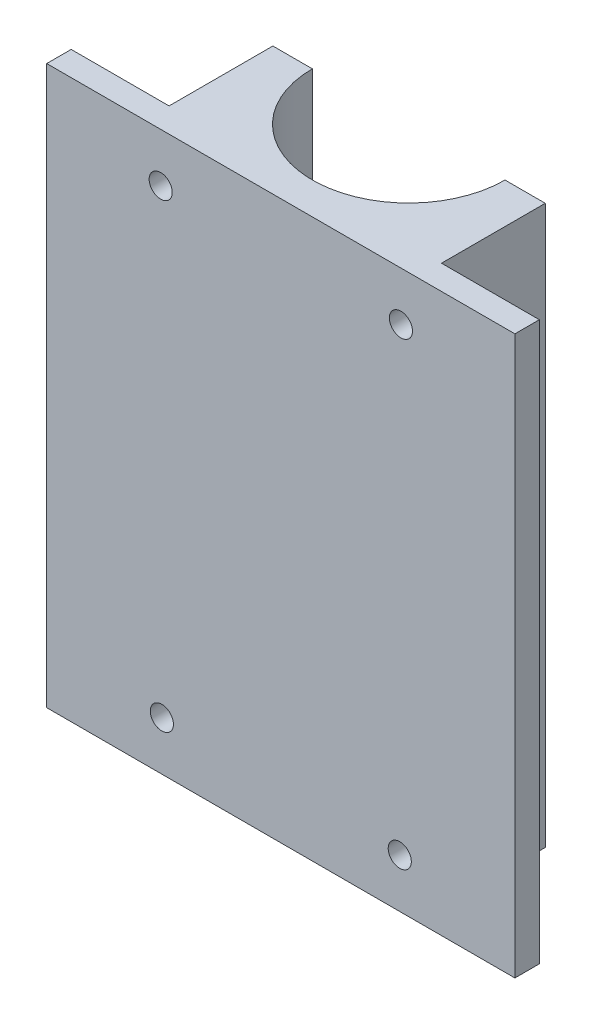
ISO-10303-21;
HEADER;
FILE_DESCRIPTION(('STEP AP214'),'2;1');
FILE_NAME('part.step','',(''),(''),'','','');
FILE_SCHEMA(('AUTOMOTIVE_DESIGN { 1 0 10303 214 1 1 1 1 }'));
ENDSEC;
DATA;
#1=APPLICATION_CONTEXT('core data for automotive mechanical design processes');
#2=APPLICATION_PROTOCOL_DEFINITION('international standard','automotive_design',2000,#1);
#3=PRODUCT_CONTEXT('',#1,'mechanical');
#4=PRODUCT('Part','Part','',(#3));
#5=PRODUCT_RELATED_PRODUCT_CATEGORY('part','',(#4));
#6=PRODUCT_DEFINITION_FORMATION('','',#4);
#7=PRODUCT_DEFINITION_CONTEXT('part definition',#1,'design');
#8=PRODUCT_DEFINITION('design','',#6,#7);
#9=PRODUCT_DEFINITION_SHAPE('','',#8);
#10=(LENGTH_UNIT() NAMED_UNIT(*) SI_UNIT(.MILLI.,.METRE.));
#11=(NAMED_UNIT(*) PLANE_ANGLE_UNIT() SI_UNIT($,.RADIAN.));
#12=(NAMED_UNIT(*) SI_UNIT($,.STERADIAN.) SOLID_ANGLE_UNIT());
#13=UNCERTAINTY_MEASURE_WITH_UNIT(LENGTH_MEASURE(1.E-05),#10,'distance_accuracy_value','');
#14=(GEOMETRIC_REPRESENTATION_CONTEXT(3) GLOBAL_UNCERTAINTY_ASSIGNED_CONTEXT((#13)) GLOBAL_UNIT_ASSIGNED_CONTEXT((#10,
#11,#12)) REPRESENTATION_CONTEXT('',''));
#15=CARTESIAN_POINT('',(0.,0.,0.));
#16=DIRECTION('',(0.,0.,1.));
#17=DIRECTION('',(1.,0.,0.));
#18=AXIS2_PLACEMENT_3D('',#15,#16,#17);
#19=CARTESIAN_POINT('',(0.,72.39,-17.6981702709716));
#20=DIRECTION('',(0.,0.,-1.));
#21=DIRECTION('',(-1.,0.,0.));
#22=AXIS2_PLACEMENT_3D('',#19,#20,#21);
#23=PLANE('',#22);
#24=DIRECTION('',(1.,0.,0.));
#25=VECTOR('',#24,1.);
#26=CARTESIAN_POINT('',(0.,0.,-17.6981702709716));
#27=LINE('',#26,#25);
#28=CARTESIAN_POINT('',(24.2033116,0.,-17.6981702709716));
#29=VERTEX_POINT('',#28);
#30=CARTESIAN_POINT('',(36.9033116,0.,-17.6981702709716));
#31=VERTEX_POINT('',#30);
#32=EDGE_CURVE('E136',#29,#31,#27,.T.);
#33=ORIENTED_EDGE('',*,*,#32,.F.);
#34=DIRECTION('',(0.,-1.,0.));
#35=VECTOR('',#34,1.);
#36=CARTESIAN_POINT('',(24.2033116,72.39,-17.6981702709716));
#37=LINE('',#36,#35);
#38=CARTESIAN_POINT('',(24.2033116,72.39,-17.6981702709716));
#39=VERTEX_POINT('',#38);
#40=EDGE_CURVE('E11',#39,#29,#37,.T.);
#41=ORIENTED_EDGE('',*,*,#40,.F.);
#42=DIRECTION('',(1.,0.,0.));
#43=VECTOR('',#42,1.);
#44=CARTESIAN_POINT('',(0.,72.39,-17.6981702709716));
#45=LINE('',#44,#43);
#46=CARTESIAN_POINT('',(36.9033116,72.39,-17.6981702709716));
#47=VERTEX_POINT('',#46);
#48=EDGE_CURVE('E159',#39,#47,#45,.T.);
#49=ORIENTED_EDGE('',*,*,#48,.T.);
#50=DIRECTION('',(0.,-1.,0.));
#51=VECTOR('',#50,1.);
#52=CARTESIAN_POINT('',(36.9033116,72.39,-17.6981702709716));
#53=LINE('',#52,#51);
#54=EDGE_CURVE('E50',#47,#31,#53,.T.);
#55=ORIENTED_EDGE('',*,*,#54,.T.);
#56=EDGE_LOOP('',(#33,#41,#49,#55));
#57=FACE_BOUND('',#56,.T.);
#58=ADVANCED_FACE('F34',(#57),#23,.T.);
#59=CARTESIAN_POINT('',(24.2033116,72.39,0.));
#60=DIRECTION('',(1.,0.,0.));
#61=DIRECTION('',(0.,0.,-1.));
#62=AXIS2_PLACEMENT_3D('',#59,#60,#61);
#63=PLANE('',#62);
#64=DIRECTION('',(0.,0.,1.));
#65=VECTOR('',#64,1.);
#66=CARTESIAN_POINT('',(24.2033116,0.,0.));
#67=LINE('',#66,#65);
#68=CARTESIAN_POINT('',(24.2033116,0.,-31.1659219200096));
#69=VERTEX_POINT('',#68);
#70=EDGE_CURVE('E138',#69,#29,#67,.T.);
#71=ORIENTED_EDGE('',*,*,#70,.F.);
#72=DIRECTION('',(0.,-1.,0.));
#73=VECTOR('',#72,1.);
#74=CARTESIAN_POINT('',(24.2033116,72.39,-31.1659219200096));
#75=LINE('',#74,#73);
#76=CARTESIAN_POINT('',(24.2033116,72.39,-31.1659219200096));
#77=VERTEX_POINT('',#76);
#78=EDGE_CURVE('E42',#77,#69,#75,.T.);
#79=ORIENTED_EDGE('',*,*,#78,.F.);
#80=DIRECTION('',(0.,0.,1.));
#81=VECTOR('',#80,1.);
#82=CARTESIAN_POINT('',(24.2033116,72.39,0.));
#83=LINE('',#82,#81);
#84=EDGE_CURVE('E192',#77,#39,#83,.T.);
#85=ORIENTED_EDGE('',*,*,#84,.T.);
#86=ORIENTED_EDGE('',*,*,#40,.T.);
#87=EDGE_LOOP('',(#71,#79,#85,#86));
#88=FACE_BOUND('',#87,.T.);
#89=ADVANCED_FACE('F191',(#88),#63,.T.);
#90=CARTESIAN_POINT('',(0.,72.39,-31.1659219200096));
#91=DIRECTION('',(0.,0.,1.));
#92=DIRECTION('',(1.,0.,0.));
#93=AXIS2_PLACEMENT_3D('',#90,#91,#92);
#94=PLANE('',#93);
#95=CARTESIAN_POINT('',(22.1133116,66.04,-31.1659219200096));
#96=DIRECTION('',(0.,0.,-1.));
#97=DIRECTION('',(-1.,0.,0.));
#98=AXIS2_PLACEMENT_3D('',#95,#96,#97);
#99=CIRCLE('',#98,1.49999999999999);
#100=CARTESIAN_POINT('',(20.6133116,66.04,-31.1659219200096));
#101=VERTEX_POINT('',#100);
#102=EDGE_CURVE('E461',#101,#101,#99,.T.);
#103=ORIENTED_EDGE('',*,*,#102,.F.);
#104=EDGE_LOOP('',(#103));
#105=FACE_BOUND('',#104,.T.);
#106=CARTESIAN_POINT('',(21.9633116,6.35,-31.1659219200096));
#107=DIRECTION('',(0.,0.,-1.));
#108=DIRECTION('',(-1.,0.,0.));
#109=AXIS2_PLACEMENT_3D('',#106,#107,#108);
#110=CIRCLE('',#109,1.49999999999999);
#111=CARTESIAN_POINT('',(20.4633116,6.35,-31.1659219200096));
#112=VERTEX_POINT('',#111);
#113=EDGE_CURVE('E407',#112,#112,#110,.T.);
#114=ORIENTED_EDGE('',*,*,#113,.F.);
#115=EDGE_LOOP('',(#114));
#116=FACE_BOUND('',#115,.T.);
#117=DIRECTION('',(-1.,0.,0.));
#118=VECTOR('',#117,1.);
#119=CARTESIAN_POINT('',(0.,0.,-31.1659219200096));
#120=LINE('',#119,#118);
#121=CARTESIAN_POINT('',(18.6796622290023,0.,-31.1659219200096));
#122=VERTEX_POINT('',#121);
#123=EDGE_CURVE('E142',#69,#122,#120,.T.);
#124=ORIENTED_EDGE('',*,*,#123,.T.);
#125=DIRECTION('',(0.,-1.,0.));
#126=VECTOR('',#125,1.);
#127=CARTESIAN_POINT('',(18.6796622290023,51.39,-31.1659219200096));
#128=LINE('',#127,#126);
#129=CARTESIAN_POINT('',(18.6796622290023,51.39,-31.1659219200096));
#130=VERTEX_POINT('',#129);
#131=EDGE_CURVE('E139',#130,#122,#128,.T.);
#132=ORIENTED_EDGE('',*,*,#131,.F.);
#133=DIRECTION('',(-1.,0.,0.));
#134=VECTOR('',#133,1.);
#135=CARTESIAN_POINT('',(18.9796622290023,51.39,-31.1659219200096));
#136=LINE('',#135,#134);
#137=CARTESIAN_POINT('',(18.9796622290023,51.39,-31.1659219200096));
#138=VERTEX_POINT('',#137);
#139=EDGE_CURVE('E441',#138,#130,#136,.T.);
#140=ORIENTED_EDGE('',*,*,#139,.F.);
#141=DIRECTION('',(0.,-1.,0.));
#142=VECTOR('',#141,1.);
#143=CARTESIAN_POINT('',(18.9796622290023,72.39,-31.1659219200096));
#144=LINE('',#143,#142);
#145=CARTESIAN_POINT('',(18.9796622290023,72.39,-31.1659219200096));
#146=VERTEX_POINT('',#145);
#147=EDGE_CURVE('E171',#146,#138,#144,.T.);
#148=ORIENTED_EDGE('',*,*,#147,.F.);
#149=DIRECTION('',(-1.,0.,0.));
#150=VECTOR('',#149,1.);
#151=CARTESIAN_POINT('',(0.,72.39,-31.1659219200096));
#152=LINE('',#151,#150);
#153=EDGE_CURVE('E180',#77,#146,#152,.T.);
#154=ORIENTED_EDGE('',*,*,#153,.F.);
#155=ORIENTED_EDGE('',*,*,#78,.T.);
#156=EDGE_LOOP('',(#124,#132,#140,#148,#154,#155));
#157=FACE_BOUND('',#156,.T.);
#158=ADVANCED_FACE('F176',(#105,#116,#157),#94,.F.);
#159=CARTESIAN_POINT('',(6.47966222900228,72.39,-31.16592191911));
#160=DIRECTION('',(0.,-1.,0.));
#161=DIRECTION('',(0.,0.,-1.));
#162=AXIS2_PLACEMENT_3D('',#159,#160,#161);
#163=CYLINDRICAL_SURFACE('',#162,12.5);
#164=CARTESIAN_POINT('',(6.47966222900228,51.39,-31.16592191911));
#165=DIRECTION('',(0.,1.,0.));
#166=DIRECTION('',(0.,0.,1.));
#167=AXIS2_PLACEMENT_3D('',#164,#165,#166);
#168=CIRCLE('',#167,12.5);
#169=CARTESIAN_POINT('',(-6.02033777099772,51.39,-31.1659219200096));
#170=VERTEX_POINT('',#169);
#171=EDGE_CURVE('E411',#170,#138,#168,.T.);
#172=ORIENTED_EDGE('',*,*,#171,.F.);
#173=DIRECTION('',(0.,-1.,0.));
#174=VECTOR('',#173,1.);
#175=CARTESIAN_POINT('',(-6.02033777099772,72.39,-31.1659219200096));
#176=LINE('',#175,#174);
#177=CARTESIAN_POINT('',(-6.02033777099772,72.39,-31.1659219200096));
#178=VERTEX_POINT('',#177);
#179=EDGE_CURVE('E168',#178,#170,#176,.T.);
#180=ORIENTED_EDGE('',*,*,#179,.F.);
#181=CARTESIAN_POINT('',(6.47966222900228,72.39,-31.16592191911));
#182=DIRECTION('',(0.,1.,0.));
#183=DIRECTION('',(0.,0.,1.));
#184=AXIS2_PLACEMENT_3D('',#181,#182,#183);
#185=CIRCLE('',#184,12.5);
#186=EDGE_CURVE('E418',#178,#146,#185,.T.);
#187=ORIENTED_EDGE('',*,*,#186,.T.);
#188=ORIENTED_EDGE('',*,*,#147,.T.);
#189=EDGE_LOOP('',(#172,#180,#187,#188));
#190=FACE_BOUND('',#189,.T.);
#191=ADVANCED_FACE('F211',(#190),#163,.F.);
#192=CARTESIAN_POINT('',(0.,72.39,-31.1659219200096));
#193=DIRECTION('',(0.,0.,1.));
#194=DIRECTION('',(1.,0.,0.));
#195=AXIS2_PLACEMENT_3D('',#192,#193,#194);
#196=PLANE('',#195);
#197=CARTESIAN_POINT('',(-9.05668840000001,66.04,-31.1659219200096));
#198=DIRECTION('',(0.,0.,-1.));
#199=DIRECTION('',(-1.,0.,0.));
#200=AXIS2_PLACEMENT_3D('',#197,#198,#199);
#201=CIRCLE('',#200,1.49999999999999);
#202=CARTESIAN_POINT('',(-10.5566884,66.04,-31.1659219200096));
#203=VERTEX_POINT('',#202);
#204=EDGE_CURVE('E455',#203,#203,#201,.T.);
#205=ORIENTED_EDGE('',*,*,#204,.F.);
#206=EDGE_LOOP('',(#205));
#207=FACE_BOUND('',#206,.T.);
#208=CARTESIAN_POINT('',(-8.9066884,6.35,-31.1659219200096));
#209=DIRECTION('',(0.,0.,-1.));
#210=DIRECTION('',(-1.,0.,0.));
#211=AXIS2_PLACEMENT_3D('',#208,#209,#210);
#212=CIRCLE('',#211,1.49999999999999);
#213=CARTESIAN_POINT('',(-10.4066884,6.35,-31.1659219200096));
#214=VERTEX_POINT('',#213);
#215=EDGE_CURVE('E449',#214,#214,#212,.T.);
#216=ORIENTED_EDGE('',*,*,#215,.F.);
#217=EDGE_LOOP('',(#216));
#218=FACE_BOUND('',#217,.T.);
#219=DIRECTION('',(-1.,0.,0.));
#220=VECTOR('',#219,1.);
#221=CARTESIAN_POINT('',(0.,0.,-31.1659219200096));
#222=LINE('',#221,#220);
#223=CARTESIAN_POINT('',(-5.72033777099772,0.,-31.1659219200096));
#224=VERTEX_POINT('',#223);
#225=CARTESIAN_POINT('',(-11.1466884,0.,-31.1659219200096));
#226=VERTEX_POINT('',#225);
#227=EDGE_CURVE('E145',#224,#226,#222,.T.);
#228=ORIENTED_EDGE('',*,*,#227,.T.);
#229=DIRECTION('',(0.,-1.,0.));
#230=VECTOR('',#229,1.);
#231=CARTESIAN_POINT('',(-11.1466884,72.39,-31.1659219200096));
#232=LINE('',#231,#230);
#233=CARTESIAN_POINT('',(-11.1466884,72.39,-31.1659219200096));
#234=VERTEX_POINT('',#233);
#235=EDGE_CURVE('E165',#234,#226,#232,.T.);
#236=ORIENTED_EDGE('',*,*,#235,.F.);
#237=DIRECTION('',(-1.,0.,0.));
#238=VECTOR('',#237,1.);
#239=CARTESIAN_POINT('',(0.,72.39,-31.1659219200096));
#240=LINE('',#239,#238);
#241=EDGE_CURVE('E421',#178,#234,#240,.T.);
#242=ORIENTED_EDGE('',*,*,#241,.F.);
#243=ORIENTED_EDGE('',*,*,#179,.T.);
#244=DIRECTION('',(1.,0.,0.));
#245=VECTOR('',#244,1.);
#246=CARTESIAN_POINT('',(-6.02033777099772,51.39,-31.1659219200096));
#247=LINE('',#246,#245);
#248=CARTESIAN_POINT('',(-5.72033777099772,51.39,-31.1659219200096));
#249=VERTEX_POINT('',#248);
#250=EDGE_CURVE('E400',#170,#249,#247,.T.);
#251=ORIENTED_EDGE('',*,*,#250,.T.);
#252=DIRECTION('',(0.,-1.,0.));
#253=VECTOR('',#252,1.);
#254=CARTESIAN_POINT('',(-5.72033777099772,51.39,-31.1659219200096));
#255=LINE('',#254,#253);
#256=EDGE_CURVE('E398',#249,#224,#255,.T.);
#257=ORIENTED_EDGE('',*,*,#256,.T.);
#258=EDGE_LOOP('',(#228,#236,#242,#243,#251,#257));
#259=FACE_BOUND('',#258,.T.);
#260=ADVANCED_FACE('F217',(#207,#218,#259),#196,.F.);
#261=CARTESIAN_POINT('',(-11.1466884,72.39,0.));
#262=DIRECTION('',(1.,0.,0.));
#263=DIRECTION('',(0.,0.,-1.));
#264=AXIS2_PLACEMENT_3D('',#261,#262,#263);
#265=PLANE('',#264);
#266=DIRECTION('',(0.,0.,1.));
#267=VECTOR('',#266,1.);
#268=CARTESIAN_POINT('',(-11.1466884,0.,0.));
#269=LINE('',#268,#267);
#270=CARTESIAN_POINT('',(-11.1466884,0.,-17.6981702709716));
#271=VERTEX_POINT('',#270);
#272=EDGE_CURVE('E147',#226,#271,#269,.T.);
#273=ORIENTED_EDGE('',*,*,#272,.T.);
#274=DIRECTION('',(0.,-1.,0.));
#275=VECTOR('',#274,1.);
#276=CARTESIAN_POINT('',(-11.1466884,72.39,-17.6981702709716));
#277=LINE('',#276,#275);
#278=CARTESIAN_POINT('',(-11.1466884,72.39,-17.6981702709716));
#279=VERTEX_POINT('',#278);
#280=EDGE_CURVE('E163',#279,#271,#277,.T.);
#281=ORIENTED_EDGE('',*,*,#280,.F.);
#282=DIRECTION('',(0.,0.,1.));
#283=VECTOR('',#282,1.);
#284=CARTESIAN_POINT('',(-11.1466884,72.39,0.));
#285=LINE('',#284,#283);
#286=EDGE_CURVE('E423',#234,#279,#285,.T.);
#287=ORIENTED_EDGE('',*,*,#286,.F.);
#288=ORIENTED_EDGE('',*,*,#235,.T.);
#289=EDGE_LOOP('',(#273,#281,#287,#288));
#290=FACE_BOUND('',#289,.T.);
#291=ADVANCED_FACE('F221',(#290),#265,.F.);
#292=CARTESIAN_POINT('',(0.,72.39,-17.6981702709716));
#293=DIRECTION('',(0.,0.,-1.));
#294=DIRECTION('',(-1.,0.,0.));
#295=AXIS2_PLACEMENT_3D('',#292,#293,#294);
#296=PLANE('',#295);
#297=DIRECTION('',(1.,0.,0.));
#298=VECTOR('',#297,1.);
#299=CARTESIAN_POINT('',(0.,0.,-17.6981702709716));
#300=LINE('',#299,#298);
#301=CARTESIAN_POINT('',(-23.8485284,0.,-17.6981702709716));
#302=VERTEX_POINT('',#301);
#303=EDGE_CURVE('E150',#302,#271,#300,.T.);
#304=ORIENTED_EDGE('',*,*,#303,.F.);
#305=DIRECTION('',(0.,-1.,0.));
#306=VECTOR('',#305,1.);
#307=CARTESIAN_POINT('',(-23.8485284,72.39,-17.6981702709716));
#308=LINE('',#307,#306);
#309=CARTESIAN_POINT('',(-23.8485284,72.39,-17.6981702709716));
#310=VERTEX_POINT('',#309);
#311=EDGE_CURVE('E128',#310,#302,#308,.T.);
#312=ORIENTED_EDGE('',*,*,#311,.F.);
#313=DIRECTION('',(1.,0.,0.));
#314=VECTOR('',#313,1.);
#315=CARTESIAN_POINT('',(0.,72.39,-17.6981702709716));
#316=LINE('',#315,#314);
#317=EDGE_CURVE('E118',#310,#279,#316,.T.);
#318=ORIENTED_EDGE('',*,*,#317,.T.);
#319=ORIENTED_EDGE('',*,*,#280,.T.);
#320=EDGE_LOOP('',(#304,#312,#318,#319));
#321=FACE_BOUND('',#320,.T.);
#322=ADVANCED_FACE('F225',(#321),#296,.T.);
#323=CARTESIAN_POINT('',(-23.8485284,72.39,0.));
#324=DIRECTION('',(1.,0.,0.));
#325=DIRECTION('',(0.,0.,-1.));
#326=AXIS2_PLACEMENT_3D('',#323,#324,#325);
#327=PLANE('',#326);
#328=DIRECTION('',(0.,0.,1.));
#329=VECTOR('',#328,1.);
#330=CARTESIAN_POINT('',(-23.8485284,0.,0.));
#331=LINE('',#330,#329);
#332=CARTESIAN_POINT('',(-23.8485284,0.,-14.5231702709716));
#333=VERTEX_POINT('',#332);
#334=EDGE_CURVE('E125',#302,#333,#331,.T.);
#335=ORIENTED_EDGE('',*,*,#334,.T.);
#336=DIRECTION('',(0.,-1.,0.));
#337=VECTOR('',#336,1.);
#338=CARTESIAN_POINT('',(-23.8485284,72.39,-14.5231702709716));
#339=LINE('',#338,#337);
#340=CARTESIAN_POINT('',(-23.8485284,72.39,-14.5231702709716));
#341=VERTEX_POINT('',#340);
#342=EDGE_CURVE('E122',#341,#333,#339,.T.);
#343=ORIENTED_EDGE('',*,*,#342,.F.);
#344=DIRECTION('',(0.,0.,1.));
#345=VECTOR('',#344,1.);
#346=CARTESIAN_POINT('',(-23.8485284,72.39,0.));
#347=LINE('',#346,#345);
#348=EDGE_CURVE('E111',#310,#341,#347,.T.);
#349=ORIENTED_EDGE('',*,*,#348,.F.);
#350=ORIENTED_EDGE('',*,*,#311,.T.);
#351=EDGE_LOOP('',(#335,#343,#349,#350));
#352=FACE_BOUND('',#351,.T.);
#353=ADVANCED_FACE('F123',(#352),#327,.F.);
#354=CARTESIAN_POINT('',(0.,72.39,-14.5231702709716));
#355=DIRECTION('',(0.,0.,-1.));
#356=DIRECTION('',(-1.,0.,0.));
#357=AXIS2_PLACEMENT_3D('',#354,#355,#356);
#358=PLANE('',#357);
#359=CARTESIAN_POINT('',(22.1133116,66.04,-14.5231702709716));
#360=DIRECTION('',(0.,0.,-1.));
#361=DIRECTION('',(-1.,0.,0.));
#362=AXIS2_PLACEMENT_3D('',#359,#360,#361);
#363=CIRCLE('',#362,1.49999999999999);
#364=CARTESIAN_POINT('',(20.6133116,66.04,-14.5231702709716));
#365=VERTEX_POINT('',#364);
#366=EDGE_CURVE('E458',#365,#365,#363,.T.);
#367=ORIENTED_EDGE('',*,*,#366,.T.);
#368=EDGE_LOOP('',(#367));
#369=FACE_BOUND('',#368,.T.);
#370=CARTESIAN_POINT('',(-9.05668840000001,66.04,-14.5231702709716));
#371=DIRECTION('',(0.,0.,-1.));
#372=DIRECTION('',(-1.,0.,0.));
#373=AXIS2_PLACEMENT_3D('',#370,#371,#372);
#374=CIRCLE('',#373,1.5);
#375=CARTESIAN_POINT('',(-10.5566884,66.04,-14.5231702709716));
#376=VERTEX_POINT('',#375);
#377=EDGE_CURVE('E452',#376,#376,#374,.T.);
#378=ORIENTED_EDGE('',*,*,#377,.T.);
#379=EDGE_LOOP('',(#378));
#380=FACE_BOUND('',#379,.T.);
#381=CARTESIAN_POINT('',(-8.9066884,6.35,-14.5231702709716));
#382=DIRECTION('',(0.,0.,-1.));
#383=DIRECTION('',(-1.,0.,0.));
#384=AXIS2_PLACEMENT_3D('',#381,#382,#383);
#385=CIRCLE('',#384,1.5);
#386=CARTESIAN_POINT('',(-10.4066884,6.35,-14.5231702709716));
#387=VERTEX_POINT('',#386);
#388=EDGE_CURVE('E446',#387,#387,#385,.T.);
#389=ORIENTED_EDGE('',*,*,#388,.T.);
#390=EDGE_LOOP('',(#389));
#391=FACE_BOUND('',#390,.T.);
#392=CARTESIAN_POINT('',(21.9633116,6.35,-14.5231702709716));
#393=DIRECTION('',(0.,0.,-1.));
#394=DIRECTION('',(-1.,0.,0.));
#395=AXIS2_PLACEMENT_3D('',#392,#393,#394);
#396=CIRCLE('',#395,1.49999999999999);
#397=CARTESIAN_POINT('',(20.4633116,6.35,-14.5231702709716));
#398=VERTEX_POINT('',#397);
#399=EDGE_CURVE('E401',#398,#398,#396,.T.);
#400=ORIENTED_EDGE('',*,*,#399,.T.);
#401=EDGE_LOOP('',(#400));
#402=FACE_BOUND('',#401,.T.);
#403=DIRECTION('',(1.,0.,0.));
#404=VECTOR('',#403,1.);
#405=CARTESIAN_POINT('',(0.,0.,-14.5231702709716));
#406=LINE('',#405,#404);
#407=CARTESIAN_POINT('',(36.9033116,0.,-14.5231702709716));
#408=VERTEX_POINT('',#407);
#409=EDGE_CURVE('E154',#333,#408,#406,.T.);
#410=ORIENTED_EDGE('',*,*,#409,.T.);
#411=DIRECTION('',(0.,-1.,0.));
#412=VECTOR('',#411,1.);
#413=CARTESIAN_POINT('',(36.9033116,72.39,-14.5231702709716));
#414=LINE('',#413,#412);
#415=CARTESIAN_POINT('',(36.9033116,72.39,-14.5231702709716));
#416=VERTEX_POINT('',#415);
#417=EDGE_CURVE('E77',#416,#408,#414,.T.);
#418=ORIENTED_EDGE('',*,*,#417,.F.);
#419=DIRECTION('',(1.,0.,0.));
#420=VECTOR('',#419,1.);
#421=CARTESIAN_POINT('',(0.,72.39,-14.5231702709716));
#422=LINE('',#421,#420);
#423=EDGE_CURVE('E116',#341,#416,#422,.T.);
#424=ORIENTED_EDGE('',*,*,#423,.F.);
#425=ORIENTED_EDGE('',*,*,#342,.T.);
#426=EDGE_LOOP('',(#410,#418,#424,#425));
#427=FACE_BOUND('',#426,.T.);
#428=ADVANCED_FACE('F130',(#369,#380,#391,#402,#427),#358,.F.);
#429=CARTESIAN_POINT('',(36.9033116,72.39,0.));
#430=DIRECTION('',(1.,0.,0.));
#431=DIRECTION('',(0.,0.,-1.));
#432=AXIS2_PLACEMENT_3D('',#429,#430,#431);
#433=PLANE('',#432);
#434=DIRECTION('',(0.,0.,1.));
#435=VECTOR('',#434,1.);
#436=CARTESIAN_POINT('',(36.9033116,0.,0.));
#437=LINE('',#436,#435);
#438=EDGE_CURVE('E156',#31,#408,#437,.T.);
#439=ORIENTED_EDGE('',*,*,#438,.F.);
#440=ORIENTED_EDGE('',*,*,#54,.F.);
#441=DIRECTION('',(0.,0.,1.));
#442=VECTOR('',#441,1.);
#443=CARTESIAN_POINT('',(36.9033116,72.39,0.));
#444=LINE('',#443,#442);
#445=EDGE_CURVE('E131',#47,#416,#444,.T.);
#446=ORIENTED_EDGE('',*,*,#445,.T.);
#447=ORIENTED_EDGE('',*,*,#417,.T.);
#448=EDGE_LOOP('',(#439,#440,#446,#447));
#449=FACE_BOUND('',#448,.T.);
#450=ADVANCED_FACE('F193',(#449),#433,.T.);
#451=CARTESIAN_POINT('',(0.,72.39,0.));
#452=DIRECTION('',(0.,1.,0.));
#453=DIRECTION('',(0.,0.,1.));
#454=AXIS2_PLACEMENT_3D('',#451,#452,#453);
#455=PLANE('',#454);
#456=ORIENTED_EDGE('',*,*,#48,.F.);
#457=ORIENTED_EDGE('',*,*,#84,.F.);
#458=ORIENTED_EDGE('',*,*,#153,.T.);
#459=ORIENTED_EDGE('',*,*,#186,.F.);
#460=ORIENTED_EDGE('',*,*,#241,.T.);
#461=ORIENTED_EDGE('',*,*,#286,.T.);
#462=ORIENTED_EDGE('',*,*,#317,.F.);
#463=ORIENTED_EDGE('',*,*,#348,.T.);
#464=ORIENTED_EDGE('',*,*,#423,.T.);
#465=ORIENTED_EDGE('',*,*,#445,.F.);
#466=EDGE_LOOP('',(#456,#457,#458,#459,#460,#461,#462,#463,#464,#465));
#467=FACE_BOUND('',#466,.T.);
#468=ADVANCED_FACE('F113',(#467),#455,.T.);
#469=CARTESIAN_POINT('',(0.,0.,0.));
#470=DIRECTION('',(0.,1.,0.));
#471=DIRECTION('',(0.,0.,1.));
#472=AXIS2_PLACEMENT_3D('',#469,#470,#471);
#473=PLANE('',#472);
#474=ORIENTED_EDGE('',*,*,#32,.T.);
#475=ORIENTED_EDGE('',*,*,#438,.T.);
#476=ORIENTED_EDGE('',*,*,#409,.F.);
#477=ORIENTED_EDGE('',*,*,#334,.F.);
#478=ORIENTED_EDGE('',*,*,#303,.T.);
#479=ORIENTED_EDGE('',*,*,#272,.F.);
#480=ORIENTED_EDGE('',*,*,#227,.F.);
#481=CARTESIAN_POINT('',(6.47966222900228,0.,-31.1659219191116));
#482=DIRECTION('',(0.,1.,0.));
#483=DIRECTION('',(0.,0.,1.));
#484=AXIS2_PLACEMENT_3D('',#481,#482,#483);
#485=CIRCLE('',#484,12.2);
#486=EDGE_CURVE('E190',#224,#122,#485,.T.);
#487=ORIENTED_EDGE('',*,*,#486,.T.);
#488=ORIENTED_EDGE('',*,*,#123,.F.);
#489=ORIENTED_EDGE('',*,*,#70,.T.);
#490=EDGE_LOOP('',(#474,#475,#476,#477,#478,#479,#480,#487,#488,#489));
#491=FACE_BOUND('',#490,.T.);
#492=ADVANCED_FACE('F187',(#491),#473,.F.);
#493=CARTESIAN_POINT('',(6.47966222900228,51.39,-31.1659219191116));
#494=DIRECTION('',(0.,-1.,0.));
#495=DIRECTION('',(0.,0.,-1.));
#496=AXIS2_PLACEMENT_3D('',#493,#494,#495);
#497=CYLINDRICAL_SURFACE('',#496,12.2);
#498=ORIENTED_EDGE('',*,*,#486,.F.);
#499=ORIENTED_EDGE('',*,*,#256,.F.);
#500=CARTESIAN_POINT('',(6.47966222900228,51.39,-31.1659219191116));
#501=DIRECTION('',(0.,1.,0.));
#502=DIRECTION('',(0.,0.,1.));
#503=AXIS2_PLACEMENT_3D('',#500,#501,#502);
#504=CIRCLE('',#503,12.2);
#505=EDGE_CURVE('E404',#249,#130,#504,.T.);
#506=ORIENTED_EDGE('',*,*,#505,.T.);
#507=ORIENTED_EDGE('',*,*,#131,.T.);
#508=EDGE_LOOP('',(#498,#499,#506,#507));
#509=FACE_BOUND('',#508,.T.);
#510=ADVANCED_FACE('F295',(#509),#497,.F.);
#511=CARTESIAN_POINT('',(6.47966222900228,51.39,-31.1659219191116));
#512=DIRECTION('',(0.,1.,0.));
#513=DIRECTION('',(0.,0.,1.));
#514=AXIS2_PLACEMENT_3D('',#511,#512,#513);
#515=PLANE('',#514);
#516=ORIENTED_EDGE('',*,*,#250,.F.);
#517=ORIENTED_EDGE('',*,*,#171,.T.);
#518=ORIENTED_EDGE('',*,*,#139,.T.);
#519=ORIENTED_EDGE('',*,*,#505,.F.);
#520=EDGE_LOOP('',(#516,#517,#518,#519));
#521=FACE_BOUND('',#520,.T.);
#522=ADVANCED_FACE('F255',(#521),#515,.T.);
#523=CARTESIAN_POINT('',(21.9633116,6.35,-31.1659219200096));
#524=DIRECTION('',(0.,0.,-1.));
#525=DIRECTION('',(-1.,0.,0.));
#526=AXIS2_PLACEMENT_3D('',#523,#524,#525);
#527=CYLINDRICAL_SURFACE('',#526,1.49999999999999);
#528=ORIENTED_EDGE('',*,*,#399,.F.);
#529=EDGE_LOOP('',(#528));
#530=FACE_BOUND('',#529,.T.);
#531=ORIENTED_EDGE('',*,*,#113,.T.);
#532=EDGE_LOOP('',(#531));
#533=FACE_BOUND('',#532,.T.);
#534=ADVANCED_FACE('F249',(#530,#533),#527,.F.);
#535=CARTESIAN_POINT('',(-8.9066884,6.35,-31.1659219200096));
#536=DIRECTION('',(0.,0.,-1.));
#537=DIRECTION('',(-1.,0.,0.));
#538=AXIS2_PLACEMENT_3D('',#535,#536,#537);
#539=CYLINDRICAL_SURFACE('',#538,1.49999999999999);
#540=ORIENTED_EDGE('',*,*,#388,.F.);
#541=EDGE_LOOP('',(#540));
#542=FACE_BOUND('',#541,.T.);
#543=ORIENTED_EDGE('',*,*,#215,.T.);
#544=EDGE_LOOP('',(#543));
#545=FACE_BOUND('',#544,.T.);
#546=ADVANCED_FACE('F254',(#542,#545),#539,.F.);
#547=CARTESIAN_POINT('',(-9.05668840000001,66.04,-31.1659219200096));
#548=DIRECTION('',(0.,0.,-1.));
#549=DIRECTION('',(-1.,0.,0.));
#550=AXIS2_PLACEMENT_3D('',#547,#548,#549);
#551=CYLINDRICAL_SURFACE('',#550,1.49999999999999);
#552=ORIENTED_EDGE('',*,*,#377,.F.);
#553=EDGE_LOOP('',(#552));
#554=FACE_BOUND('',#553,.T.);
#555=ORIENTED_EDGE('',*,*,#204,.T.);
#556=EDGE_LOOP('',(#555));
#557=FACE_BOUND('',#556,.T.);
#558=ADVANCED_FACE('F267',(#554,#557),#551,.F.);
#559=CARTESIAN_POINT('',(22.1133116,66.04,-31.1659219200096));
#560=DIRECTION('',(0.,0.,-1.));
#561=DIRECTION('',(-1.,0.,0.));
#562=AXIS2_PLACEMENT_3D('',#559,#560,#561);
#563=CYLINDRICAL_SURFACE('',#562,1.49999999999999);
#564=ORIENTED_EDGE('',*,*,#366,.F.);
#565=EDGE_LOOP('',(#564));
#566=FACE_BOUND('',#565,.T.);
#567=ORIENTED_EDGE('',*,*,#102,.T.);
#568=EDGE_LOOP('',(#567));
#569=FACE_BOUND('',#568,.T.);
#570=ADVANCED_FACE('F277',(#566,#569),#563,.F.);
#571=CLOSED_SHELL('',(#58,#89,#158,#191,#260,#291,#322,#353,#428,#450,#468,#492,#510,#522,#534,
#546,#558,#570));
#572=MANIFOLD_SOLID_BREP('B2',#571);
#573=ADVANCED_BREP_SHAPE_REPRESENTATION('',(#18,#572),#14);
#574=SHAPE_DEFINITION_REPRESENTATION(#9,#573);
ENDSEC;
END-ISO-10303-21;
